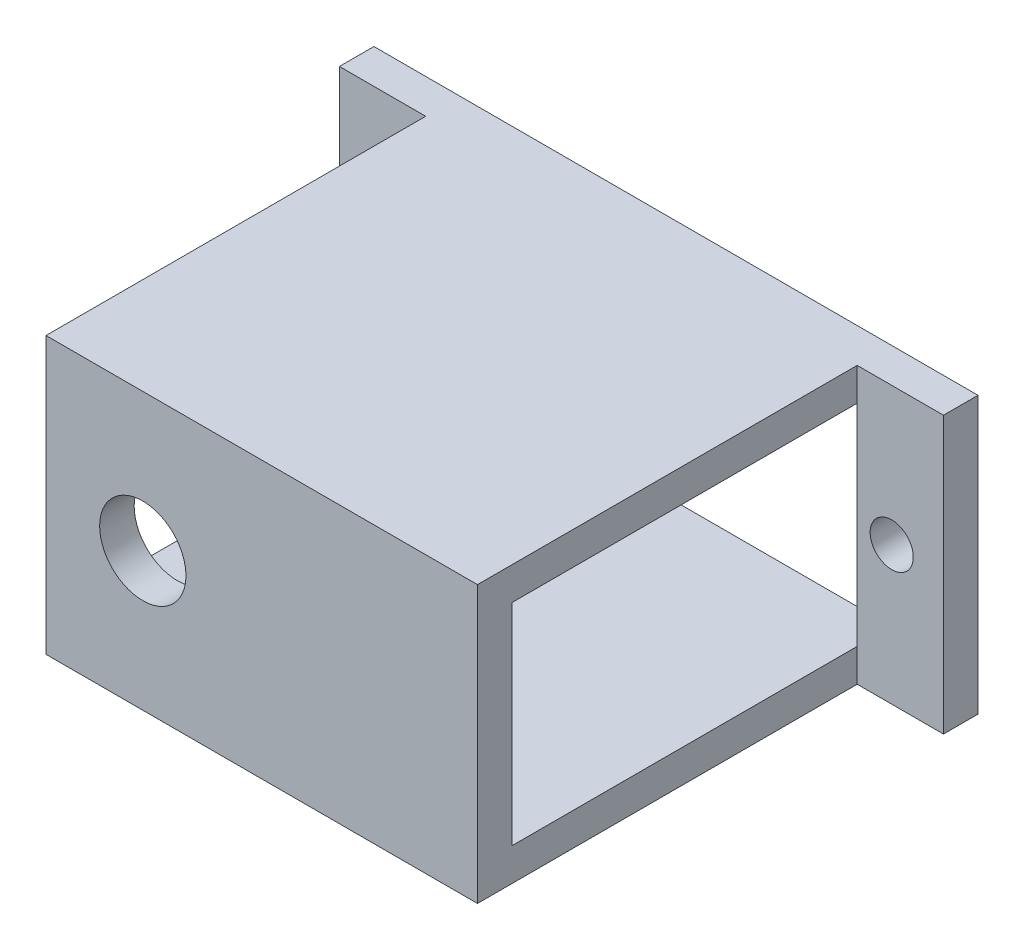
ISO-10303-21;
HEADER;
FILE_DESCRIPTION(('STEP AP214'),'2;1');
FILE_NAME('part.step','',(''),(''),'','','');
FILE_SCHEMA(('AUTOMOTIVE_DESIGN { 1 0 10303 214 1 1 1 1 }'));
ENDSEC;
DATA;
#1=APPLICATION_CONTEXT('core data for automotive mechanical design processes');
#2=APPLICATION_PROTOCOL_DEFINITION('international standard','automotive_design',2000,#1);
#3=PRODUCT_CONTEXT('',#1,'mechanical');
#4=PRODUCT('Part','Part','',(#3));
#5=PRODUCT_RELATED_PRODUCT_CATEGORY('part','',(#4));
#6=PRODUCT_DEFINITION_FORMATION('','',#4);
#7=PRODUCT_DEFINITION_CONTEXT('part definition',#1,'design');
#8=PRODUCT_DEFINITION('design','',#6,#7);
#9=PRODUCT_DEFINITION_SHAPE('','',#8);
#10=(LENGTH_UNIT() NAMED_UNIT(*) SI_UNIT(.MILLI.,.METRE.));
#11=(NAMED_UNIT(*) PLANE_ANGLE_UNIT() SI_UNIT($,.RADIAN.));
#12=(NAMED_UNIT(*) SI_UNIT($,.STERADIAN.) SOLID_ANGLE_UNIT());
#13=UNCERTAINTY_MEASURE_WITH_UNIT(LENGTH_MEASURE(1.E-05),#10,'distance_accuracy_value','');
#14=(GEOMETRIC_REPRESENTATION_CONTEXT(3) GLOBAL_UNCERTAINTY_ASSIGNED_CONTEXT((#13)) GLOBAL_UNIT_ASSIGNED_CONTEXT((#10,
#11,#12)) REPRESENTATION_CONTEXT('',''));
#15=CARTESIAN_POINT('',(0.,0.,0.));
#16=DIRECTION('',(0.,0.,1.));
#17=DIRECTION('',(1.,0.,0.));
#18=AXIS2_PLACEMENT_3D('',#15,#16,#17);
#19=CARTESIAN_POINT('',(-12.5,6.1,2.));
#20=DIRECTION('',(0.,1.,0.));
#21=DIRECTION('',(-1.,0.,0.));
#22=AXIS2_PLACEMENT_3D('',#19,#20,#21);
#23=PLANE('',#22);
#24=DIRECTION('',(-1.,0.,0.));
#25=VECTOR('',#24,1.);
#26=CARTESIAN_POINT('',(-12.5,6.1,22.));
#27=LINE('',#26,#25);
#28=CARTESIAN_POINT('',(12.5,6.1,22.));
#29=VERTEX_POINT('',#28);
#30=CARTESIAN_POINT('',(-12.5,6.1,22.));
#31=VERTEX_POINT('',#30);
#32=EDGE_CURVE('E153',#29,#31,#27,.T.);
#33=ORIENTED_EDGE('',*,*,#32,.T.);
#34=DIRECTION('',(0.,0.,-1.));
#35=VECTOR('',#34,1.);
#36=CARTESIAN_POINT('',(-12.5,6.1,24.));
#37=LINE('',#36,#35);
#38=CARTESIAN_POINT('',(-12.5,6.1,2.));
#39=VERTEX_POINT('',#38);
#40=EDGE_CURVE('E166',#31,#39,#37,.T.);
#41=ORIENTED_EDGE('',*,*,#40,.T.);
#42=DIRECTION('',(0.,0.,-1.));
#43=VECTOR('',#42,1.);
#44=CARTESIAN_POINT('',(-12.5,6.1,2.));
#45=LINE('',#44,#43);
#46=CARTESIAN_POINT('',(-12.5,6.1,0.));
#47=VERTEX_POINT('',#46);
#48=EDGE_CURVE('E55',#39,#47,#45,.T.);
#49=ORIENTED_EDGE('',*,*,#48,.T.);
#50=DIRECTION('',(1.,0.,0.));
#51=VECTOR('',#50,1.);
#52=CARTESIAN_POINT('',(-12.5,6.1,0.));
#53=LINE('',#52,#51);
#54=CARTESIAN_POINT('',(12.5,6.1,0.));
#55=VERTEX_POINT('',#54);
#56=EDGE_CURVE('E291',#47,#55,#53,.T.);
#57=ORIENTED_EDGE('',*,*,#56,.T.);
#58=DIRECTION('',(0.,0.,-1.));
#59=VECTOR('',#58,1.);
#60=CARTESIAN_POINT('',(12.5,6.1,2.));
#61=LINE('',#60,#59);
#62=CARTESIAN_POINT('',(12.5,6.1,2.));
#63=VERTEX_POINT('',#62);
#64=EDGE_CURVE('E246',#63,#55,#61,.T.);
#65=ORIENTED_EDGE('',*,*,#64,.F.);
#66=DIRECTION('',(0.,0.,-1.));
#67=VECTOR('',#66,1.);
#68=CARTESIAN_POINT('',(12.5,6.1,24.));
#69=LINE('',#68,#67);
#70=EDGE_CURVE('E168',#29,#63,#69,.T.);
#71=ORIENTED_EDGE('',*,*,#70,.F.);
#72=EDGE_LOOP('',(#33,#41,#49,#57,#65,#71));
#73=FACE_BOUND('',#72,.T.);
#74=ADVANCED_FACE('F45',(#73),#23,.F.);
#75=CARTESIAN_POINT('',(-12.5,-6.09999999999997,2.));
#76=DIRECTION('',(0.,-1.,0.));
#77=DIRECTION('',(-1.,0.,0.));
#78=AXIS2_PLACEMENT_3D('',#75,#76,#77);
#79=PLANE('',#78);
#80=DIRECTION('',(-1.,0.,0.));
#81=VECTOR('',#80,1.);
#82=CARTESIAN_POINT('',(-12.5,-6.09999999999996,22.));
#83=LINE('',#82,#81);
#84=CARTESIAN_POINT('',(12.5,-6.10000000000004,22.));
#85=VERTEX_POINT('',#84);
#86=CARTESIAN_POINT('',(-12.5,-6.09999999999996,22.));
#87=VERTEX_POINT('',#86);
#88=EDGE_CURVE('E156',#85,#87,#83,.T.);
#89=ORIENTED_EDGE('',*,*,#88,.F.);
#90=DIRECTION('',(0.,0.,-1.));
#91=VECTOR('',#90,1.);
#92=CARTESIAN_POINT('',(12.5,-6.09999999999997,24.));
#93=LINE('',#92,#91);
#94=CARTESIAN_POINT('',(12.5,-6.09999999999997,2.));
#95=VERTEX_POINT('',#94);
#96=EDGE_CURVE('E186',#85,#95,#93,.T.);
#97=ORIENTED_EDGE('',*,*,#96,.T.);
#98=DIRECTION('',(0.,0.,-1.));
#99=VECTOR('',#98,1.);
#100=CARTESIAN_POINT('',(12.5,-6.09999999999997,2.));
#101=LINE('',#100,#99);
#102=CARTESIAN_POINT('',(12.5,-6.09999999999997,0.));
#103=VERTEX_POINT('',#102);
#104=EDGE_CURVE('E175',#95,#103,#101,.T.);
#105=ORIENTED_EDGE('',*,*,#104,.T.);
#106=DIRECTION('',(1.,0.,0.));
#107=VECTOR('',#106,1.);
#108=CARTESIAN_POINT('',(-12.5,-6.09999999999997,0.));
#109=LINE('',#108,#107);
#110=CARTESIAN_POINT('',(-12.5,-6.09999999999997,0.));
#111=VERTEX_POINT('',#110);
#112=EDGE_CURVE('E222',#111,#103,#109,.T.);
#113=ORIENTED_EDGE('',*,*,#112,.F.);
#114=DIRECTION('',(0.,0.,-1.));
#115=VECTOR('',#114,1.);
#116=CARTESIAN_POINT('',(-12.5,-6.09999999999997,2.));
#117=LINE('',#116,#115);
#118=CARTESIAN_POINT('',(-12.5,-6.09999999999997,2.));
#119=VERTEX_POINT('',#118);
#120=EDGE_CURVE('E217',#119,#111,#117,.T.);
#121=ORIENTED_EDGE('',*,*,#120,.F.);
#122=DIRECTION('',(0.,0.,-1.));
#123=VECTOR('',#122,1.);
#124=CARTESIAN_POINT('',(-12.5,-6.09999999999997,24.));
#125=LINE('',#124,#123);
#126=EDGE_CURVE('E189',#87,#119,#125,.T.);
#127=ORIENTED_EDGE('',*,*,#126,.F.);
#128=EDGE_LOOP('',(#89,#97,#105,#113,#121,#127));
#129=FACE_BOUND('',#128,.T.);
#130=ADVANCED_FACE('F365',(#129),#79,.F.);
#131=CARTESIAN_POINT('',(-14.5,0.,2.));
#132=DIRECTION('',(0.,0.,1.));
#133=DIRECTION('',(1.,0.,0.));
#134=AXIS2_PLACEMENT_3D('',#131,#132,#133);
#135=PLANE('',#134);
#136=DIRECTION('',(0.,-1.,0.));
#137=VECTOR('',#136,1.);
#138=CARTESIAN_POINT('',(-12.5,7.99999999999995,2.));
#139=LINE('',#138,#137);
#140=CARTESIAN_POINT('',(-12.5,8.,2.));
#141=VERTEX_POINT('',#140);
#142=EDGE_CURVE('E70',#141,#39,#139,.T.);
#143=ORIENTED_EDGE('',*,*,#142,.F.);
#144=DIRECTION('',(-1.,0.,0.));
#145=VECTOR('',#144,1.);
#146=CARTESIAN_POINT('',(-17.5,8.,2.));
#147=LINE('',#146,#145);
#148=CARTESIAN_POINT('',(-17.5,8.,2.));
#149=VERTEX_POINT('',#148);
#150=EDGE_CURVE('E268',#141,#149,#147,.T.);
#151=ORIENTED_EDGE('',*,*,#150,.T.);
#152=DIRECTION('',(0.,-1.,0.));
#153=VECTOR('',#152,1.);
#154=CARTESIAN_POINT('',(-17.5,0.,2.));
#155=LINE('',#154,#153);
#156=CARTESIAN_POINT('',(-17.5,-7.99999999999996,2.));
#157=VERTEX_POINT('',#156);
#158=EDGE_CURVE('E267',#149,#157,#155,.T.);
#159=ORIENTED_EDGE('',*,*,#158,.T.);
#160=DIRECTION('',(-1.,0.,0.));
#161=VECTOR('',#160,1.);
#162=CARTESIAN_POINT('',(-17.5,-7.99999999999996,2.));
#163=LINE('',#162,#161);
#164=CARTESIAN_POINT('',(-12.5,-8.,2.));
#165=VERTEX_POINT('',#164);
#166=EDGE_CURVE('E218',#165,#157,#163,.T.);
#167=ORIENTED_EDGE('',*,*,#166,.F.);
#168=DIRECTION('',(0.,-1.,0.));
#169=VECTOR('',#168,1.);
#170=CARTESIAN_POINT('',(-12.5,-6.09999999999997,2.));
#171=LINE('',#170,#169);
#172=EDGE_CURVE('E201',#119,#165,#171,.T.);
#173=ORIENTED_EDGE('',*,*,#172,.F.);
#174=DIRECTION('',(0.,1.,0.));
#175=VECTOR('',#174,1.);
#176=CARTESIAN_POINT('',(-12.5,0.,2.));
#177=LINE('',#176,#175);
#178=EDGE_CURVE('E276',#119,#39,#177,.T.);
#179=ORIENTED_EDGE('',*,*,#178,.T.);
#180=EDGE_LOOP('',(#143,#151,#159,#167,#173,#179));
#181=FACE_BOUND('',#180,.T.);
#182=CARTESIAN_POINT('',(-14.5,0.,2.));
#183=DIRECTION('',(0.,0.,-1.));
#184=DIRECTION('',(1.,0.,0.));
#185=AXIS2_PLACEMENT_3D('',#182,#183,#184);
#186=CIRCLE('',#185,1.25);
#187=CARTESIAN_POINT('',(-13.25,0.,2.));
#188=VERTEX_POINT('',#187);
#189=EDGE_CURVE('E272',#188,#188,#186,.T.);
#190=ORIENTED_EDGE('',*,*,#189,.T.);
#191=EDGE_LOOP('',(#190));
#192=FACE_BOUND('',#191,.T.);
#193=ADVANCED_FACE('F359',(#181,#192),#135,.T.);
#194=CARTESIAN_POINT('',(-17.5,8.,2.));
#195=DIRECTION('',(0.,-1.,0.));
#196=DIRECTION('',(0.,0.,-1.));
#197=AXIS2_PLACEMENT_3D('',#194,#195,#196);
#198=PLANE('',#197);
#199=DIRECTION('',(-1.,0.,0.));
#200=VECTOR('',#199,1.);
#201=CARTESIAN_POINT('',(-17.5,8.,0.));
#202=LINE('',#201,#200);
#203=CARTESIAN_POINT('',(17.5,8.,0.));
#204=VERTEX_POINT('',#203);
#205=CARTESIAN_POINT('',(-17.5,8.,0.));
#206=VERTEX_POINT('',#205);
#207=EDGE_CURVE('E263',#204,#206,#202,.T.);
#208=ORIENTED_EDGE('',*,*,#207,.T.);
#209=DIRECTION('',(0.,0.,-1.));
#210=VECTOR('',#209,1.);
#211=CARTESIAN_POINT('',(-17.5,8.,2.));
#212=LINE('',#211,#210);
#213=EDGE_CURVE('E11',#149,#206,#212,.T.);
#214=ORIENTED_EDGE('',*,*,#213,.F.);
#215=ORIENTED_EDGE('',*,*,#150,.F.);
#216=DIRECTION('',(0.,0.,-1.));
#217=VECTOR('',#216,1.);
#218=CARTESIAN_POINT('',(-12.5,7.99999999999995,24.));
#219=LINE('',#218,#217);
#220=CARTESIAN_POINT('',(-12.5,7.99999999999995,24.));
#221=VERTEX_POINT('',#220);
#222=EDGE_CURVE('E325',#221,#141,#219,.T.);
#223=ORIENTED_EDGE('',*,*,#222,.F.);
#224=DIRECTION('',(-1.,0.,0.));
#225=VECTOR('',#224,1.);
#226=CARTESIAN_POINT('',(-12.5,7.99999999999995,24.));
#227=LINE('',#226,#225);
#228=CARTESIAN_POINT('',(12.5,7.99999999999995,24.));
#229=VERTEX_POINT('',#228);
#230=EDGE_CURVE('E327',#229,#221,#227,.T.);
#231=ORIENTED_EDGE('',*,*,#230,.F.);
#232=DIRECTION('',(0.,0.,-1.));
#233=VECTOR('',#232,1.);
#234=CARTESIAN_POINT('',(12.5,7.99999999999995,24.));
#235=LINE('',#234,#233);
#236=CARTESIAN_POINT('',(12.5,7.99999999999995,2.));
#237=VERTEX_POINT('',#236);
#238=EDGE_CURVE('E182',#229,#237,#235,.T.);
#239=ORIENTED_EDGE('',*,*,#238,.T.);
#240=CARTESIAN_POINT('',(17.5,8.,2.));
#241=VERTEX_POINT('',#240);
#242=EDGE_CURVE('E264',#241,#237,#147,.T.);
#243=ORIENTED_EDGE('',*,*,#242,.F.);
#244=DIRECTION('',(0.,0.,-1.));
#245=VECTOR('',#244,1.);
#246=CARTESIAN_POINT('',(17.5,8.,2.));
#247=LINE('',#246,#245);
#248=EDGE_CURVE('E259',#241,#204,#247,.T.);
#249=ORIENTED_EDGE('',*,*,#248,.T.);
#250=EDGE_LOOP('',(#208,#214,#215,#223,#231,#239,#243,#249));
#251=FACE_BOUND('',#250,.T.);
#252=ADVANCED_FACE('F47',(#251),#198,.F.);
#253=CARTESIAN_POINT('',(-17.5,0.,2.));
#254=DIRECTION('',(1.,0.,0.));
#255=DIRECTION('',(0.,0.,-1.));
#256=AXIS2_PLACEMENT_3D('',#253,#254,#255);
#257=PLANE('',#256);
#258=DIRECTION('',(0.,-1.,0.));
#259=VECTOR('',#258,1.);
#260=CARTESIAN_POINT('',(-17.5,0.,0.));
#261=LINE('',#260,#259);
#262=CARTESIAN_POINT('',(-17.5,-7.99999999999996,0.));
#263=VERTEX_POINT('',#262);
#264=EDGE_CURVE('E281',#206,#263,#261,.T.);
#265=ORIENTED_EDGE('',*,*,#264,.T.);
#266=DIRECTION('',(0.,0.,-1.));
#267=VECTOR('',#266,1.);
#268=CARTESIAN_POINT('',(-17.5,-7.99999999999996,2.));
#269=LINE('',#268,#267);
#270=EDGE_CURVE('E229',#157,#263,#269,.T.);
#271=ORIENTED_EDGE('',*,*,#270,.F.);
#272=ORIENTED_EDGE('',*,*,#158,.F.);
#273=ORIENTED_EDGE('',*,*,#213,.T.);
#274=EDGE_LOOP('',(#265,#271,#272,#273));
#275=FACE_BOUND('',#274,.T.);
#276=ADVANCED_FACE('F354',(#275),#257,.F.);
#277=CARTESIAN_POINT('',(-14.5,0.,2.));
#278=DIRECTION('',(0.,0.,-1.));
#279=DIRECTION('',(-1.,0.,0.));
#280=AXIS2_PLACEMENT_3D('',#277,#278,#279);
#281=CYLINDRICAL_SURFACE('',#280,1.25);
#282=CARTESIAN_POINT('',(-14.5,0.,0.));
#283=DIRECTION('',(0.,0.,-1.));
#284=DIRECTION('',(1.,0.,0.));
#285=AXIS2_PLACEMENT_3D('',#282,#283,#284);
#286=CIRCLE('',#285,1.25);
#287=CARTESIAN_POINT('',(-13.25,0.,0.));
#288=VERTEX_POINT('',#287);
#289=EDGE_CURVE('E284',#288,#288,#286,.T.);
#290=ORIENTED_EDGE('',*,*,#289,.T.);
#291=EDGE_LOOP('',(#290));
#292=FACE_BOUND('',#291,.T.);
#293=ORIENTED_EDGE('',*,*,#189,.F.);
#294=EDGE_LOOP('',(#293));
#295=FACE_BOUND('',#294,.T.);
#296=ADVANCED_FACE('F404',(#292,#295),#281,.F.);
#297=CARTESIAN_POINT('',(-12.5,0.,2.));
#298=DIRECTION('',(-1.,0.,0.));
#299=DIRECTION('',(0.,0.,1.));
#300=AXIS2_PLACEMENT_3D('',#297,#298,#299);
#301=PLANE('',#300);
#302=DIRECTION('',(0.,1.,0.));
#303=VECTOR('',#302,1.);
#304=CARTESIAN_POINT('',(-12.5,0.,0.));
#305=LINE('',#304,#303);
#306=EDGE_CURVE('E288',#111,#47,#305,.T.);
#307=ORIENTED_EDGE('',*,*,#306,.T.);
#308=ORIENTED_EDGE('',*,*,#48,.F.);
#309=ORIENTED_EDGE('',*,*,#178,.F.);
#310=ORIENTED_EDGE('',*,*,#120,.T.);
#311=EDGE_LOOP('',(#307,#308,#309,#310));
#312=FACE_BOUND('',#311,.T.);
#313=ADVANCED_FACE('F363',(#312),#301,.F.);
#314=DIRECTION('',(0.,1.,0.));
#315=VECTOR('',#314,1.);
#316=CARTESIAN_POINT('',(12.5,7.99999999999995,2.));
#317=LINE('',#316,#315);
#318=EDGE_CURVE('E310',#63,#237,#317,.T.);
#319=ORIENTED_EDGE('',*,*,#318,.F.);
#320=DIRECTION('',(0.,1.,0.));
#321=VECTOR('',#320,1.);
#322=CARTESIAN_POINT('',(12.5,0.,2.));
#323=LINE('',#322,#321);
#324=EDGE_CURVE('E242',#95,#63,#323,.T.);
#325=ORIENTED_EDGE('',*,*,#324,.F.);
#326=DIRECTION('',(0.,1.,0.));
#327=VECTOR('',#326,1.);
#328=CARTESIAN_POINT('',(12.5,-6.09999999999997,2.));
#329=LINE('',#328,#327);
#330=CARTESIAN_POINT('',(12.5,-8.00000000000003,2.));
#331=VERTEX_POINT('',#330);
#332=EDGE_CURVE('E62',#331,#95,#329,.T.);
#333=ORIENTED_EDGE('',*,*,#332,.F.);
#334=CARTESIAN_POINT('',(17.5,-7.99999999999996,2.));
#335=VERTEX_POINT('',#334);
#336=EDGE_CURVE('E214',#335,#331,#163,.T.);
#337=ORIENTED_EDGE('',*,*,#336,.F.);
#338=DIRECTION('',(0.,-1.,0.));
#339=VECTOR('',#338,1.);
#340=CARTESIAN_POINT('',(17.5,0.,2.));
#341=LINE('',#340,#339);
#342=EDGE_CURVE('E234',#241,#335,#341,.T.);
#343=ORIENTED_EDGE('',*,*,#342,.F.);
#344=ORIENTED_EDGE('',*,*,#242,.T.);
#345=EDGE_LOOP('',(#319,#325,#333,#337,#343,#344));
#346=FACE_BOUND('',#345,.T.);
#347=CARTESIAN_POINT('',(14.5,0.,2.));
#348=DIRECTION('',(0.,0.,1.));
#349=DIRECTION('',(-1.,0.,0.));
#350=AXIS2_PLACEMENT_3D('',#347,#348,#349);
#351=CIRCLE('',#350,1.25);
#352=CARTESIAN_POINT('',(13.25,0.,2.));
#353=VERTEX_POINT('',#352);
#354=EDGE_CURVE('E237',#353,#353,#351,.T.);
#355=ORIENTED_EDGE('',*,*,#354,.F.);
#356=EDGE_LOOP('',(#355));
#357=FACE_BOUND('',#356,.T.);
#358=ADVANCED_FACE('F307',(#346,#357),#135,.T.);
#359=CARTESIAN_POINT('',(-14.5,0.,0.));
#360=DIRECTION('',(0.,0.,1.));
#361=DIRECTION('',(1.,0.,0.));
#362=AXIS2_PLACEMENT_3D('',#359,#360,#361);
#363=PLANE('',#362);
#364=ORIENTED_EDGE('',*,*,#207,.F.);
#365=DIRECTION('',(0.,-1.,0.));
#366=VECTOR('',#365,1.);
#367=CARTESIAN_POINT('',(17.5,0.,0.));
#368=LINE('',#367,#366);
#369=CARTESIAN_POINT('',(17.5,-7.99999999999996,0.));
#370=VERTEX_POINT('',#369);
#371=EDGE_CURVE('E233',#204,#370,#368,.T.);
#372=ORIENTED_EDGE('',*,*,#371,.T.);
#373=DIRECTION('',(-1.,0.,0.));
#374=VECTOR('',#373,1.);
#375=CARTESIAN_POINT('',(-17.5,-7.99999999999996,0.));
#376=LINE('',#375,#374);
#377=EDGE_CURVE('E213',#370,#263,#376,.T.);
#378=ORIENTED_EDGE('',*,*,#377,.T.);
#379=ORIENTED_EDGE('',*,*,#264,.F.);
#380=EDGE_LOOP('',(#364,#372,#378,#379));
#381=FACE_BOUND('',#380,.T.);
#382=ORIENTED_EDGE('',*,*,#289,.F.);
#383=EDGE_LOOP('',(#382));
#384=FACE_BOUND('',#383,.T.);
#385=DIRECTION('',(0.,1.,0.));
#386=VECTOR('',#385,1.);
#387=CARTESIAN_POINT('',(12.5,0.,0.));
#388=LINE('',#387,#386);
#389=EDGE_CURVE('E238',#103,#55,#388,.T.);
#390=ORIENTED_EDGE('',*,*,#389,.T.);
#391=ORIENTED_EDGE('',*,*,#56,.F.);
#392=ORIENTED_EDGE('',*,*,#306,.F.);
#393=ORIENTED_EDGE('',*,*,#112,.T.);
#394=EDGE_LOOP('',(#390,#391,#392,#393));
#395=FACE_BOUND('',#394,.T.);
#396=CARTESIAN_POINT('',(14.5,0.,0.));
#397=DIRECTION('',(0.,0.,1.));
#398=DIRECTION('',(-1.,0.,0.));
#399=AXIS2_PLACEMENT_3D('',#396,#397,#398);
#400=CIRCLE('',#399,1.25);
#401=CARTESIAN_POINT('',(13.25,0.,0.));
#402=VERTEX_POINT('',#401);
#403=EDGE_CURVE('E249',#402,#402,#400,.T.);
#404=ORIENTED_EDGE('',*,*,#403,.T.);
#405=EDGE_LOOP('',(#404));
#406=FACE_BOUND('',#405,.T.);
#407=ADVANCED_FACE('F300',(#381,#384,#395,#406),#363,.F.);
#408=CARTESIAN_POINT('',(17.5,0.,2.));
#409=DIRECTION('',(-1.,0.,0.));
#410=DIRECTION('',(0.,0.,-1.));
#411=AXIS2_PLACEMENT_3D('',#408,#409,#410);
#412=PLANE('',#411);
#413=ORIENTED_EDGE('',*,*,#371,.F.);
#414=ORIENTED_EDGE('',*,*,#248,.F.);
#415=ORIENTED_EDGE('',*,*,#342,.T.);
#416=DIRECTION('',(0.,0.,-1.));
#417=VECTOR('',#416,1.);
#418=CARTESIAN_POINT('',(17.5,-7.99999999999996,2.));
#419=LINE('',#418,#417);
#420=EDGE_CURVE('E180',#335,#370,#419,.T.);
#421=ORIENTED_EDGE('',*,*,#420,.T.);
#422=EDGE_LOOP('',(#413,#414,#415,#421));
#423=FACE_BOUND('',#422,.T.);
#424=ADVANCED_FACE('F348',(#423),#412,.F.);
#425=CARTESIAN_POINT('',(14.5,0.,2.));
#426=DIRECTION('',(0.,0.,-1.));
#427=DIRECTION('',(1.,0.,0.));
#428=AXIS2_PLACEMENT_3D('',#425,#426,#427);
#429=CYLINDRICAL_SURFACE('',#428,1.25);
#430=ORIENTED_EDGE('',*,*,#403,.F.);
#431=EDGE_LOOP('',(#430));
#432=FACE_BOUND('',#431,.T.);
#433=ORIENTED_EDGE('',*,*,#354,.T.);
#434=EDGE_LOOP('',(#433));
#435=FACE_BOUND('',#434,.T.);
#436=ADVANCED_FACE('F426',(#432,#435),#429,.F.);
#437=CARTESIAN_POINT('',(12.5,0.,2.));
#438=DIRECTION('',(1.,0.,0.));
#439=DIRECTION('',(0.,0.,1.));
#440=AXIS2_PLACEMENT_3D('',#437,#438,#439);
#441=PLANE('',#440);
#442=ORIENTED_EDGE('',*,*,#389,.F.);
#443=ORIENTED_EDGE('',*,*,#104,.F.);
#444=ORIENTED_EDGE('',*,*,#324,.T.);
#445=ORIENTED_EDGE('',*,*,#64,.T.);
#446=EDGE_LOOP('',(#442,#443,#444,#445));
#447=FACE_BOUND('',#446,.T.);
#448=ADVANCED_FACE('F305',(#447),#441,.F.);
#449=CARTESIAN_POINT('',(-17.5,-7.99999999999996,2.));
#450=DIRECTION('',(0.,1.,0.));
#451=DIRECTION('',(0.,0.,-1.));
#452=AXIS2_PLACEMENT_3D('',#449,#450,#451);
#453=PLANE('',#452);
#454=ORIENTED_EDGE('',*,*,#377,.F.);
#455=ORIENTED_EDGE('',*,*,#420,.F.);
#456=ORIENTED_EDGE('',*,*,#336,.T.);
#457=DIRECTION('',(0.,0.,-1.));
#458=VECTOR('',#457,1.);
#459=CARTESIAN_POINT('',(12.5,-8.,24.));
#460=LINE('',#459,#458);
#461=CARTESIAN_POINT('',(12.5,-8.,24.));
#462=VERTEX_POINT('',#461);
#463=EDGE_CURVE('E196',#462,#331,#460,.T.);
#464=ORIENTED_EDGE('',*,*,#463,.F.);
#465=DIRECTION('',(1.,0.,0.));
#466=VECTOR('',#465,1.);
#467=CARTESIAN_POINT('',(-12.5,-8.,24.));
#468=LINE('',#467,#466);
#469=CARTESIAN_POINT('',(-12.5,-8.,24.));
#470=VERTEX_POINT('',#469);
#471=EDGE_CURVE('E200',#470,#462,#468,.T.);
#472=ORIENTED_EDGE('',*,*,#471,.F.);
#473=DIRECTION('',(0.,0.,-1.));
#474=VECTOR('',#473,1.);
#475=CARTESIAN_POINT('',(-12.5,-8.,24.));
#476=LINE('',#475,#474);
#477=EDGE_CURVE('E192',#470,#165,#476,.T.);
#478=ORIENTED_EDGE('',*,*,#477,.T.);
#479=ORIENTED_EDGE('',*,*,#166,.T.);
#480=ORIENTED_EDGE('',*,*,#270,.T.);
#481=EDGE_LOOP('',(#454,#455,#456,#464,#472,#478,#479,#480));
#482=FACE_BOUND('',#481,.T.);
#483=ADVANCED_FACE('F343',(#482),#453,.F.);
#484=CARTESIAN_POINT('',(-12.5,7.99999999999995,24.));
#485=DIRECTION('',(1.,0.,0.));
#486=DIRECTION('',(0.,1.,0.));
#487=AXIS2_PLACEMENT_3D('',#484,#485,#486);
#488=PLANE('',#487);
#489=ORIENTED_EDGE('',*,*,#142,.T.);
#490=ORIENTED_EDGE('',*,*,#40,.F.);
#491=DIRECTION('',(0.,-1.,0.));
#492=VECTOR('',#491,1.);
#493=CARTESIAN_POINT('',(-12.5,8.00199999999998,22.));
#494=LINE('',#493,#492);
#495=EDGE_CURVE('E150',#31,#87,#494,.T.);
#496=ORIENTED_EDGE('',*,*,#495,.T.);
#497=ORIENTED_EDGE('',*,*,#126,.T.);
#498=ORIENTED_EDGE('',*,*,#172,.T.);
#499=ORIENTED_EDGE('',*,*,#477,.F.);
#500=DIRECTION('',(0.,-1.,0.));
#501=VECTOR('',#500,1.);
#502=CARTESIAN_POINT('',(-12.5,7.99999999999995,24.));
#503=LINE('',#502,#501);
#504=EDGE_CURVE('E316',#221,#470,#503,.T.);
#505=ORIENTED_EDGE('',*,*,#504,.F.);
#506=ORIENTED_EDGE('',*,*,#222,.T.);
#507=EDGE_LOOP('',(#489,#490,#496,#497,#498,#499,#505,#506));
#508=FACE_BOUND('',#507,.T.);
#509=ADVANCED_FACE('F172',(#508),#488,.F.);
#510=CARTESIAN_POINT('',(12.5,7.99999999999995,24.));
#511=DIRECTION('',(-1.,0.,0.));
#512=DIRECTION('',(0.,-1.,0.));
#513=AXIS2_PLACEMENT_3D('',#510,#511,#512);
#514=PLANE('',#513);
#515=ORIENTED_EDGE('',*,*,#318,.T.);
#516=ORIENTED_EDGE('',*,*,#238,.F.);
#517=DIRECTION('',(0.,1.,0.));
#518=VECTOR('',#517,1.);
#519=CARTESIAN_POINT('',(12.5,7.99999999999995,24.));
#520=LINE('',#519,#518);
#521=EDGE_CURVE('E320',#462,#229,#520,.T.);
#522=ORIENTED_EDGE('',*,*,#521,.F.);
#523=ORIENTED_EDGE('',*,*,#463,.T.);
#524=ORIENTED_EDGE('',*,*,#332,.T.);
#525=ORIENTED_EDGE('',*,*,#96,.F.);
#526=DIRECTION('',(0.,-1.,0.));
#527=VECTOR('',#526,1.);
#528=CARTESIAN_POINT('',(12.5,8.00199999999989,22.));
#529=LINE('',#528,#527);
#530=EDGE_CURVE('E161',#29,#85,#529,.T.);
#531=ORIENTED_EDGE('',*,*,#530,.F.);
#532=ORIENTED_EDGE('',*,*,#70,.T.);
#533=EDGE_LOOP('',(#515,#516,#522,#523,#524,#525,#531,#532));
#534=FACE_BOUND('',#533,.T.);
#535=ADVANCED_FACE('F332',(#534),#514,.F.);
#536=CARTESIAN_POINT('',(0.,0.,24.));
#537=DIRECTION('',(0.,0.,1.));
#538=DIRECTION('',(1.,0.,0.));
#539=AXIS2_PLACEMENT_3D('',#536,#537,#538);
#540=PLANE('',#539);
#541=CARTESIAN_POINT('',(-6.89210787200523,0.,24.));
#542=DIRECTION('',(0.,0.,1.));
#543=DIRECTION('',(1.,0.,0.));
#544=AXIS2_PLACEMENT_3D('',#541,#542,#543);
#545=CIRCLE('',#544,2.5);
#546=CARTESIAN_POINT('',(-9.39210787200523,0.,24.));
#547=VERTEX_POINT('',#546);
#548=EDGE_CURVE('E170',#547,#547,#545,.F.);
#549=ORIENTED_EDGE('',*,*,#548,.T.);
#550=EDGE_LOOP('',(#549));
#551=FACE_BOUND('',#550,.T.);
#552=ORIENTED_EDGE('',*,*,#504,.T.);
#553=ORIENTED_EDGE('',*,*,#471,.T.);
#554=ORIENTED_EDGE('',*,*,#521,.T.);
#555=ORIENTED_EDGE('',*,*,#230,.T.);
#556=EDGE_LOOP('',(#552,#553,#554,#555));
#557=FACE_BOUND('',#556,.T.);
#558=ADVANCED_FACE('F338',(#551,#557),#540,.T.);
#559=CARTESIAN_POINT('',(-12.5,8.00199999999998,22.));
#560=DIRECTION('',(0.,0.,1.));
#561=DIRECTION('',(1.,0.,0.));
#562=AXIS2_PLACEMENT_3D('',#559,#560,#561);
#563=PLANE('',#562);
#564=CARTESIAN_POINT('',(-6.89210787200523,0.,22.));
#565=DIRECTION('',(0.,0.,1.));
#566=DIRECTION('',(1.,0.,0.));
#567=AXIS2_PLACEMENT_3D('',#564,#565,#566);
#568=CIRCLE('',#567,2.5);
#569=CARTESIAN_POINT('',(-9.39210787200523,0.,22.));
#570=VERTEX_POINT('',#569);
#571=EDGE_CURVE('E49',#570,#570,#568,.F.);
#572=ORIENTED_EDGE('',*,*,#571,.F.);
#573=EDGE_LOOP('',(#572));
#574=FACE_BOUND('',#573,.T.);
#575=ORIENTED_EDGE('',*,*,#32,.F.);
#576=ORIENTED_EDGE('',*,*,#530,.T.);
#577=ORIENTED_EDGE('',*,*,#88,.T.);
#578=ORIENTED_EDGE('',*,*,#495,.F.);
#579=EDGE_LOOP('',(#575,#576,#577,#578));
#580=FACE_BOUND('',#579,.T.);
#581=ADVANCED_FACE('F152',(#574,#580),#563,.F.);
#582=CARTESIAN_POINT('',(-6.89210787200523,0.,24.000012));
#583=DIRECTION('',(0.,0.,-1.));
#584=DIRECTION('',(-1.,0.,0.));
#585=AXIS2_PLACEMENT_3D('',#582,#583,#584);
#586=CYLINDRICAL_SURFACE('',#585,2.5);
#587=CARTESIAN_POINT('',(-9.39210787200523,0.,24.));
#588=CARTESIAN_POINT('',(-9.39210787200523,0.,23.9791666666667));
#589=CARTESIAN_POINT('',(-9.39210787200523,0.,23.9583333333333));
#590=CARTESIAN_POINT('',(-9.39210787200523,0.,23.9166666666667));
#591=CARTESIAN_POINT('',(-9.39210787200523,0.,23.8958333333333));
#592=CARTESIAN_POINT('',(-9.39210787200523,0.,23.8541666666667));
#593=CARTESIAN_POINT('',(-9.39210787200523,0.,23.8333333333333));
#594=CARTESIAN_POINT('',(-9.39210787200523,0.,23.7916666666667));
#595=CARTESIAN_POINT('',(-9.39210787200523,0.,23.7708333333333));
#596=CARTESIAN_POINT('',(-9.39210787200523,0.,23.7291666666667));
#597=CARTESIAN_POINT('',(-9.39210787200523,0.,23.7083333333333));
#598=CARTESIAN_POINT('',(-9.39210787200523,0.,23.6666666666667));
#599=CARTESIAN_POINT('',(-9.39210787200523,0.,23.6458333333333));
#600=CARTESIAN_POINT('',(-9.39210787200523,0.,23.6041666666667));
#601=CARTESIAN_POINT('',(-9.39210787200523,0.,23.5833333333333));
#602=CARTESIAN_POINT('',(-9.39210787200523,0.,23.5416666666667));
#603=CARTESIAN_POINT('',(-9.39210787200523,0.,23.5208333333333));
#604=CARTESIAN_POINT('',(-9.39210787200523,0.,23.4791666666667));
#605=CARTESIAN_POINT('',(-9.39210787200523,0.,23.4583333333333));
#606=CARTESIAN_POINT('',(-9.39210787200523,0.,23.4166666666667));
#607=CARTESIAN_POINT('',(-9.39210787200523,0.,23.3958333333333));
#608=CARTESIAN_POINT('',(-9.39210787200523,0.,23.3541666666667));
#609=CARTESIAN_POINT('',(-9.39210787200523,0.,23.3333333333333));
#610=CARTESIAN_POINT('',(-9.39210787200523,0.,23.2916666666667));
#611=CARTESIAN_POINT('',(-9.39210787200523,0.,23.2708333333333));
#612=CARTESIAN_POINT('',(-9.39210787200523,0.,23.2291666666667));
#613=CARTESIAN_POINT('',(-9.39210787200523,0.,23.2083333333333));
#614=CARTESIAN_POINT('',(-9.39210787200523,0.,23.1666666666667));
#615=CARTESIAN_POINT('',(-9.39210787200523,0.,23.1458333333333));
#616=CARTESIAN_POINT('',(-9.39210787200523,0.,23.1041666666667));
#617=CARTESIAN_POINT('',(-9.39210787200523,0.,23.0833333333333));
#618=CARTESIAN_POINT('',(-9.39210787200523,0.,23.0416666666667));
#619=CARTESIAN_POINT('',(-9.39210787200523,0.,23.0208333333333));
#620=CARTESIAN_POINT('',(-9.39210787200523,0.,22.9791666666667));
#621=CARTESIAN_POINT('',(-9.39210787200523,0.,22.9583333333333));
#622=CARTESIAN_POINT('',(-9.39210787200523,0.,22.9166666666667));
#623=CARTESIAN_POINT('',(-9.39210787200523,0.,22.8958333333333));
#624=CARTESIAN_POINT('',(-9.39210787200523,0.,22.8541666666667));
#625=CARTESIAN_POINT('',(-9.39210787200523,0.,22.8333333333333));
#626=CARTESIAN_POINT('',(-9.39210787200523,0.,22.7916666666667));
#627=CARTESIAN_POINT('',(-9.39210787200523,0.,22.7708333333333));
#628=CARTESIAN_POINT('',(-9.39210787200523,0.,22.7291666666667));
#629=CARTESIAN_POINT('',(-9.39210787200523,0.,22.7083333333333));
#630=CARTESIAN_POINT('',(-9.39210787200523,0.,22.6666666666667));
#631=CARTESIAN_POINT('',(-9.39210787200523,0.,22.6458333333333));
#632=CARTESIAN_POINT('',(-9.39210787200523,0.,22.6041666666667));
#633=CARTESIAN_POINT('',(-9.39210787200523,0.,22.5833333333333));
#634=CARTESIAN_POINT('',(-9.39210787200523,0.,22.5416666666667));
#635=CARTESIAN_POINT('',(-9.39210787200523,0.,22.5208333333333));
#636=CARTESIAN_POINT('',(-9.39210787200523,0.,22.4791666666667));
#637=CARTESIAN_POINT('',(-9.39210787200523,0.,22.4583333333333));
#638=CARTESIAN_POINT('',(-9.39210787200523,0.,22.4166666666667));
#639=CARTESIAN_POINT('',(-9.39210787200523,0.,22.3958333333333));
#640=CARTESIAN_POINT('',(-9.39210787200523,0.,22.3541666666667));
#641=CARTESIAN_POINT('',(-9.39210787200523,0.,22.3333333333333));
#642=CARTESIAN_POINT('',(-9.39210787200523,0.,22.2916666666667));
#643=CARTESIAN_POINT('',(-9.39210787200523,0.,22.2708333333333));
#644=CARTESIAN_POINT('',(-9.39210787200523,0.,22.2291666666667));
#645=CARTESIAN_POINT('',(-9.39210787200523,0.,22.2083333333333));
#646=CARTESIAN_POINT('',(-9.39210787200523,0.,22.1666666666667));
#647=CARTESIAN_POINT('',(-9.39210787200523,0.,22.1458333333333));
#648=CARTESIAN_POINT('',(-9.39210787200523,0.,22.1041666666667));
#649=CARTESIAN_POINT('',(-9.39210787200523,0.,22.0833333333333));
#650=CARTESIAN_POINT('',(-9.39210787200523,0.,22.0416666666667));
#651=CARTESIAN_POINT('',(-9.39210787200523,0.,22.0208333333333));
#652=CARTESIAN_POINT('',(-9.39210787200523,0.,22.));
#653=B_SPLINE_CURVE_WITH_KNOTS('',3,(#587,#588,#589,#590,#591,#592,#593,#594,#595,#596,#597,
#598,#599,#600,#601,#602,#603,#604,#605,#606,#607,#608,#609,#610,#611,#612,#613,#614,#615,#616,
#617,#618,#619,#620,#621,#622,#623,#624,#625,#626,#627,#628,#629,#630,#631,#632,#633,#634,#635,
#636,#637,#638,#639,#640,#641,#642,#643,#644,#645,#646,#647,#648,#649,#650,#651,#652),
.UNSPECIFIED.,.F.,.F.,(4,2,2,2,2,2,2,2,2,2,2,2,2,2,2,2,2,2,2,2,2,2,2,2,2,2,2,2,2,2,2,2,4),(0.,
0.0625000000000001,0.125,0.1875,0.25,0.3125,0.375,0.4375,0.5,0.5625,0.625000000000001,
0.687500000000001,0.750000000000001,0.812500000000001,0.875000000000001,0.937500000000001,1.,
1.0625,1.125,1.1875,1.25,1.3125,1.375,1.4375,1.5,1.5625,1.625,1.6875,1.75,1.8125,1.875,1.9375,
2.),.UNSPECIFIED.);
#654=EDGE_CURVE('BSEAM381',#547,#570,#653,.T.);
#655=ORIENTED_EDGE('',*,*,#548,.F.);
#656=ORIENTED_EDGE('',*,*,#571,.T.);
#657=ORIENTED_EDGE('',*,*,#654,.T.);
#658=ORIENTED_EDGE('',*,*,#654,.F.);
#659=EDGE_LOOP('',(#655,#657,#656,#658));
#660=FACE_BOUND('',#659,.T.);
#661=ADVANCED_FACE('F381',(#660),#586,.F.);
#662=CLOSED_SHELL('',(#74,#130,#193,#252,#276,#296,#313,#358,#407,#424,#436,#448,#483,#509,#535,
#558,#581,#661));
#663=MANIFOLD_SOLID_BREP('B2',#662);
#664=ADVANCED_BREP_SHAPE_REPRESENTATION('',(#18,#663),#14);
#665=SHAPE_DEFINITION_REPRESENTATION(#9,#664);
ENDSEC;
END-ISO-10303-21;
